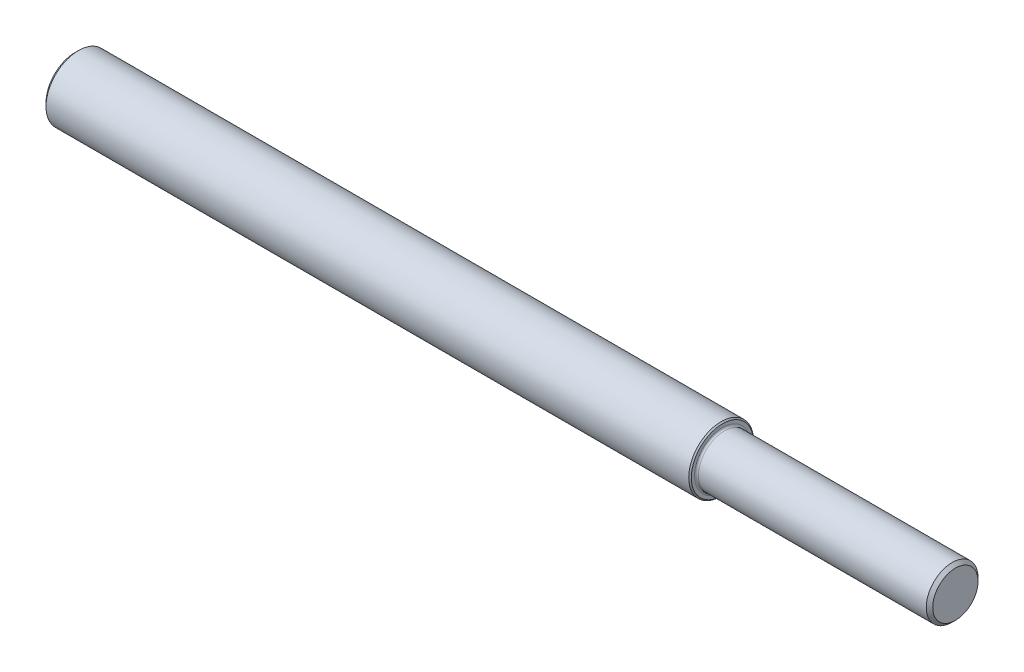
ISO-10303-21;
HEADER;
FILE_DESCRIPTION(('STEP AP214'),'2;1');
FILE_NAME('part.step','',(''),(''),'','','');
FILE_SCHEMA(('AUTOMOTIVE_DESIGN { 1 0 10303 214 1 1 1 1 }'));
ENDSEC;
DATA;
#1=APPLICATION_CONTEXT('core data for automotive mechanical design processes');
#2=APPLICATION_PROTOCOL_DEFINITION('international standard','automotive_design',2000,#1);
#3=PRODUCT_CONTEXT('',#1,'mechanical');
#4=PRODUCT('Part','Part','',(#3));
#5=PRODUCT_RELATED_PRODUCT_CATEGORY('part','',(#4));
#6=PRODUCT_DEFINITION_FORMATION('','',#4);
#7=PRODUCT_DEFINITION_CONTEXT('part definition',#1,'design');
#8=PRODUCT_DEFINITION('design','',#6,#7);
#9=PRODUCT_DEFINITION_SHAPE('','',#8);
#10=(LENGTH_UNIT() NAMED_UNIT(*) SI_UNIT(.MILLI.,.METRE.));
#11=(NAMED_UNIT(*) PLANE_ANGLE_UNIT() SI_UNIT($,.RADIAN.));
#12=(NAMED_UNIT(*) SI_UNIT($,.STERADIAN.) SOLID_ANGLE_UNIT());
#13=UNCERTAINTY_MEASURE_WITH_UNIT(LENGTH_MEASURE(1.E-05),#10,'distance_accuracy_value','');
#14=(GEOMETRIC_REPRESENTATION_CONTEXT(3) GLOBAL_UNCERTAINTY_ASSIGNED_CONTEXT((#13)) GLOBAL_UNIT_ASSIGNED_CONTEXT((#10,
#11,#12)) REPRESENTATION_CONTEXT('',''));
#15=CARTESIAN_POINT('',(0.,0.,0.));
#16=DIRECTION('',(0.,0.,1.));
#17=DIRECTION('',(1.,0.,0.));
#18=AXIS2_PLACEMENT_3D('',#15,#16,#17);
#19=CARTESIAN_POINT('',(136.,3.5,0.));
#20=DIRECTION('',(-1.,0.,0.));
#21=DIRECTION('',(0.,0.,1.));
#22=AXIS2_PLACEMENT_3D('',#19,#20,#21);
#23=PLANE('',#22);
#24=CARTESIAN_POINT('',(136.,0.,0.));
#25=DIRECTION('',(-1.,0.,0.));
#26=DIRECTION('',(0.,0.,1.));
#27=AXIS2_PLACEMENT_3D('',#24,#25,#26);
#28=CIRCLE('',#27,3.5);
#29=CARTESIAN_POINT('',(136.,0.,3.5));
#30=VERTEX_POINT('',#29);
#31=EDGE_CURVE('E10',#30,#30,#28,.T.);
#32=ORIENTED_EDGE('',*,*,#31,.F.);
#33=EDGE_LOOP('',(#32));
#34=FACE_BOUND('',#33,.T.);
#35=ADVANCED_FACE('F30',(#34),#23,.F.);
#36=CARTESIAN_POINT('',(136.,0.,0.));
#37=DIRECTION('',(-1.,0.,0.));
#38=DIRECTION('',(0.,0.,1.));
#39=AXIS2_PLACEMENT_3D('',#36,#37,#38);
#40=CONICAL_SURFACE('',#39,3.5,0.785398163397448);
#41=CARTESIAN_POINT('',(135.5,0.,0.));
#42=DIRECTION('',(-1.,0.,0.));
#43=DIRECTION('',(0.,0.,1.));
#44=AXIS2_PLACEMENT_3D('',#41,#42,#43);
#45=CIRCLE('',#44,4.);
#46=CARTESIAN_POINT('',(135.5,0.,4.));
#47=VERTEX_POINT('',#46);
#48=EDGE_CURVE('E36',#47,#47,#45,.T.);
#49=ORIENTED_EDGE('',*,*,#48,.F.);
#50=EDGE_LOOP('',(#49));
#51=FACE_BOUND('',#50,.T.);
#52=ORIENTED_EDGE('',*,*,#31,.T.);
#53=EDGE_LOOP('',(#52));
#54=FACE_BOUND('',#53,.T.);
#55=ADVANCED_FACE('F96',(#51,#54),#40,.T.);
#56=CARTESIAN_POINT('',(136.,0.,0.));
#57=DIRECTION('',(-1.,0.,0.));
#58=DIRECTION('',(0.,0.,1.));
#59=AXIS2_PLACEMENT_3D('',#56,#57,#58);
#60=CYLINDRICAL_SURFACE('',#59,4.);
#61=CARTESIAN_POINT('',(100.3,0.,0.));
#62=DIRECTION('',(-1.,0.,0.));
#63=DIRECTION('',(0.,0.,1.));
#64=AXIS2_PLACEMENT_3D('',#61,#62,#63);
#65=CIRCLE('',#64,4.);
#66=CARTESIAN_POINT('',(100.3,0.,4.));
#67=VERTEX_POINT('',#66);
#68=EDGE_CURVE('E40',#67,#67,#65,.T.);
#69=ORIENTED_EDGE('',*,*,#68,.F.);
#70=EDGE_LOOP('',(#69));
#71=FACE_BOUND('',#70,.T.);
#72=ORIENTED_EDGE('',*,*,#48,.T.);
#73=EDGE_LOOP('',(#72));
#74=FACE_BOUND('',#73,.T.);
#75=ADVANCED_FACE('F91',(#71,#74),#60,.T.);
#76=CARTESIAN_POINT('',(100.299999999993,0.,0.));
#77=DIRECTION('',(-1.,0.,0.));
#78=DIRECTION('',(0.,0.,1.));
#79=AXIS2_PLACEMENT_3D('',#76,#77,#78);
#80=TOROIDAL_SURFACE('',#79,4.29999999999304,0.29999999999304);
#81=CARTESIAN_POINT('',(100.,0.,0.));
#82=DIRECTION('',(-1.,0.,0.));
#83=DIRECTION('',(0.,0.,1.));
#84=AXIS2_PLACEMENT_3D('',#81,#82,#83);
#85=CIRCLE('',#84,4.3);
#86=CARTESIAN_POINT('',(100.,0.,4.3));
#87=VERTEX_POINT('',#86);
#88=EDGE_CURVE('E44',#87,#87,#85,.T.);
#89=ORIENTED_EDGE('',*,*,#88,.F.);
#90=EDGE_LOOP('',(#89));
#91=FACE_BOUND('',#90,.T.);
#92=ORIENTED_EDGE('',*,*,#68,.T.);
#93=EDGE_LOOP('',(#92));
#94=FACE_BOUND('',#93,.T.);
#95=ADVANCED_FACE('F85',(#91,#94),#80,.F.);
#96=CARTESIAN_POINT('',(100.,4.8,0.));
#97=DIRECTION('',(-1.,0.,0.));
#98=DIRECTION('',(0.,0.,1.));
#99=AXIS2_PLACEMENT_3D('',#96,#97,#98);
#100=PLANE('',#99);
#101=CARTESIAN_POINT('',(100.,0.,0.));
#102=DIRECTION('',(-1.,0.,0.));
#103=DIRECTION('',(0.,0.,1.));
#104=AXIS2_PLACEMENT_3D('',#101,#102,#103);
#105=CIRCLE('',#104,4.8);
#106=CARTESIAN_POINT('',(100.,0.,4.8));
#107=VERTEX_POINT('',#106);
#108=EDGE_CURVE('E49',#107,#107,#105,.T.);
#109=ORIENTED_EDGE('',*,*,#108,.F.);
#110=EDGE_LOOP('',(#109));
#111=FACE_BOUND('',#110,.T.);
#112=ORIENTED_EDGE('',*,*,#88,.T.);
#113=EDGE_LOOP('',(#112));
#114=FACE_BOUND('',#113,.T.);
#115=ADVANCED_FACE('F79',(#111,#114),#100,.F.);
#116=CARTESIAN_POINT('',(100.,0.,0.));
#117=DIRECTION('',(-1.,0.,0.));
#118=DIRECTION('',(0.,0.,1.));
#119=AXIS2_PLACEMENT_3D('',#116,#117,#118);
#120=CONICAL_SURFACE('',#119,4.8,0.785398163397435);
#121=CARTESIAN_POINT('',(99.8,0.,0.));
#122=DIRECTION('',(-1.,0.,0.));
#123=DIRECTION('',(0.,0.,1.));
#124=AXIS2_PLACEMENT_3D('',#121,#122,#123);
#125=CIRCLE('',#124,5.);
#126=CARTESIAN_POINT('',(99.8,0.,5.));
#127=VERTEX_POINT('',#126);
#128=EDGE_CURVE('E52',#127,#127,#125,.T.);
#129=ORIENTED_EDGE('',*,*,#128,.F.);
#130=EDGE_LOOP('',(#129));
#131=FACE_BOUND('',#130,.T.);
#132=ORIENTED_EDGE('',*,*,#108,.T.);
#133=EDGE_LOOP('',(#132));
#134=FACE_BOUND('',#133,.T.);
#135=ADVANCED_FACE('F73',(#131,#134),#120,.T.);
#136=CARTESIAN_POINT('',(136.,0.,0.));
#137=DIRECTION('',(-1.,0.,0.));
#138=DIRECTION('',(0.,0.,1.));
#139=AXIS2_PLACEMENT_3D('',#136,#137,#138);
#140=CYLINDRICAL_SURFACE('',#139,5.);
#141=CARTESIAN_POINT('',(0.5,0.,0.));
#142=DIRECTION('',(-1.,0.,0.));
#143=DIRECTION('',(0.,0.,1.));
#144=AXIS2_PLACEMENT_3D('',#141,#142,#143);
#145=CIRCLE('',#144,5.);
#146=CARTESIAN_POINT('',(0.5,0.,5.));
#147=VERTEX_POINT('',#146);
#148=EDGE_CURVE('E55',#147,#147,#145,.T.);
#149=ORIENTED_EDGE('',*,*,#148,.F.);
#150=EDGE_LOOP('',(#149));
#151=FACE_BOUND('',#150,.T.);
#152=ORIENTED_EDGE('',*,*,#128,.T.);
#153=EDGE_LOOP('',(#152));
#154=FACE_BOUND('',#153,.T.);
#155=ADVANCED_FACE('F67',(#151,#154),#140,.T.);
#156=CARTESIAN_POINT('',(0.5,0.,0.));
#157=DIRECTION('',(1.,0.,0.));
#158=DIRECTION('',(0.,0.,-1.));
#159=AXIS2_PLACEMENT_3D('',#156,#157,#158);
#160=CONICAL_SURFACE('',#159,5.,0.785398163397448);
#161=CARTESIAN_POINT('',(0.,0.,0.));
#162=DIRECTION('',(-1.,0.,0.));
#163=DIRECTION('',(0.,0.,1.));
#164=AXIS2_PLACEMENT_3D('',#161,#162,#163);
#165=CIRCLE('',#164,4.5);
#166=CARTESIAN_POINT('',(0.,0.,4.5));
#167=VERTEX_POINT('',#166);
#168=EDGE_CURVE('E58',#167,#167,#165,.T.);
#169=ORIENTED_EDGE('',*,*,#168,.F.);
#170=EDGE_LOOP('',(#169));
#171=FACE_BOUND('',#170,.T.);
#172=ORIENTED_EDGE('',*,*,#148,.T.);
#173=EDGE_LOOP('',(#172));
#174=FACE_BOUND('',#173,.T.);
#175=ADVANCED_FACE('F64',(#171,#174),#160,.T.);
#176=CARTESIAN_POINT('',(0.,0.,0.));
#177=DIRECTION('',(1.,0.,0.));
#178=DIRECTION('',(0.,0.,-1.));
#179=AXIS2_PLACEMENT_3D('',#176,#177,#178);
#180=PLANE('',#179);
#181=ORIENTED_EDGE('',*,*,#168,.T.);
#182=EDGE_LOOP('',(#181));
#183=FACE_BOUND('',#182,.T.);
#184=ADVANCED_FACE('F62',(#183),#180,.F.);
#185=CLOSED_SHELL('',(#35,#55,#75,#95,#115,#135,#155,#175,#184));
#186=MANIFOLD_SOLID_BREP('B2',#185);
#187=ADVANCED_BREP_SHAPE_REPRESENTATION('',(#18,#186),#14);
#188=SHAPE_DEFINITION_REPRESENTATION(#9,#187);
ENDSEC;
END-ISO-10303-21;
